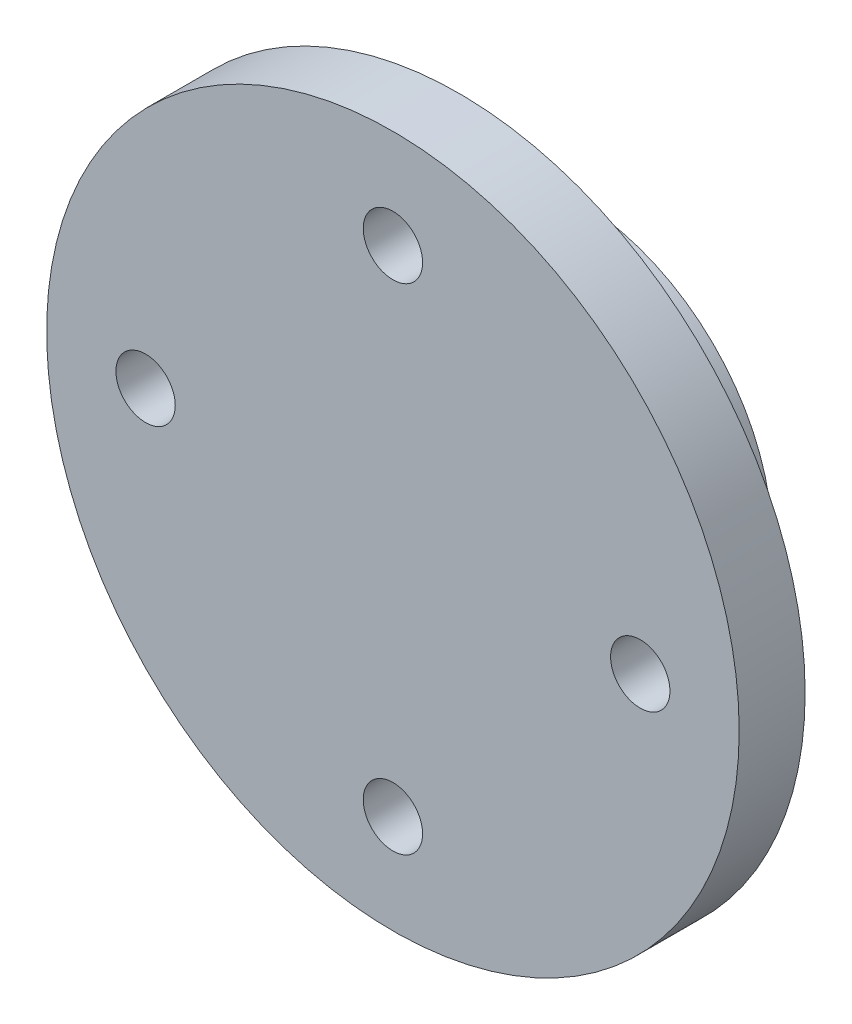
ISO-10303-21;
HEADER;
FILE_DESCRIPTION(('STEP AP214'),'2;1');
FILE_NAME('part.step','',(''),(''),'','','');
FILE_SCHEMA(('AUTOMOTIVE_DESIGN { 1 0 10303 214 1 1 1 1 }'));
ENDSEC;
DATA;
#1=APPLICATION_CONTEXT('core data for automotive mechanical design processes');
#2=APPLICATION_PROTOCOL_DEFINITION('international standard','automotive_design',2000,#1);
#3=PRODUCT_CONTEXT('',#1,'mechanical');
#4=PRODUCT('Part','Part','',(#3));
#5=PRODUCT_RELATED_PRODUCT_CATEGORY('part','',(#4));
#6=PRODUCT_DEFINITION_FORMATION('','',#4);
#7=PRODUCT_DEFINITION_CONTEXT('part definition',#1,'design');
#8=PRODUCT_DEFINITION('design','',#6,#7);
#9=PRODUCT_DEFINITION_SHAPE('','',#8);
#10=(LENGTH_UNIT() NAMED_UNIT(*) SI_UNIT(.MILLI.,.METRE.));
#11=(NAMED_UNIT(*) PLANE_ANGLE_UNIT() SI_UNIT($,.RADIAN.));
#12=(NAMED_UNIT(*) SI_UNIT($,.STERADIAN.) SOLID_ANGLE_UNIT());
#13=UNCERTAINTY_MEASURE_WITH_UNIT(LENGTH_MEASURE(1.E-05),#10,'distance_accuracy_value','');
#14=(GEOMETRIC_REPRESENTATION_CONTEXT(3) GLOBAL_UNCERTAINTY_ASSIGNED_CONTEXT((#13)) GLOBAL_UNIT_ASSIGNED_CONTEXT((#10,
#11,#12)) REPRESENTATION_CONTEXT('',''));
#15=CARTESIAN_POINT('',(0.,0.,0.));
#16=DIRECTION('',(0.,0.,1.));
#17=DIRECTION('',(1.,0.,0.));
#18=AXIS2_PLACEMENT_3D('',#15,#16,#17);
#19=CARTESIAN_POINT('',(0.,0.,0.));
#20=DIRECTION('',(0.,0.,1.));
#21=DIRECTION('',(1.,0.,0.));
#22=AXIS2_PLACEMENT_3D('',#19,#20,#21);
#23=PLANE('',#22);
#24=CARTESIAN_POINT('',(0.,0.,0.));
#25=DIRECTION('',(0.,0.,1.));
#26=DIRECTION('',(1.,0.,0.));
#27=AXIS2_PLACEMENT_3D('',#24,#25,#26);
#28=CIRCLE('',#27,6.);
#29=CARTESIAN_POINT('',(6.,0.,0.));
#30=VERTEX_POINT('',#29);
#31=EDGE_CURVE('E10',#30,#30,#28,.T.);
#32=ORIENTED_EDGE('',*,*,#31,.F.);
#33=EDGE_LOOP('',(#32));
#34=FACE_BOUND('',#33,.T.);
#35=ADVANCED_FACE('F15',(#34),#23,.F.);
#36=CARTESIAN_POINT('',(0.,0.,0.));
#37=DIRECTION('',(0.,0.,1.));
#38=DIRECTION('',(1.,0.,0.));
#39=AXIS2_PLACEMENT_3D('',#36,#37,#38);
#40=CYLINDRICAL_SURFACE('',#39,6.);
#41=CARTESIAN_POINT('',(0.,0.,3.5));
#42=DIRECTION('',(0.,0.,1.));
#43=DIRECTION('',(1.,0.,0.));
#44=AXIS2_PLACEMENT_3D('',#41,#42,#43);
#45=CIRCLE('',#44,6.);
#46=CARTESIAN_POINT('',(6.,0.,3.5));
#47=VERTEX_POINT('',#46);
#48=EDGE_CURVE('E108',#47,#47,#45,.T.);
#49=ORIENTED_EDGE('',*,*,#48,.F.);
#50=DIRECTION('',(0.,0.,1.));
#51=VECTOR('',#50,1.);
#52=CARTESIAN_POINT('',(6.,0.,0.));
#53=LINE('',#52,#51);
#54=EDGE_CURVE('E23',#30,#47,#53,.T.);
#55=ORIENTED_EDGE('',*,*,#54,.F.);
#56=ORIENTED_EDGE('',*,*,#31,.T.);
#57=ORIENTED_EDGE('',*,*,#54,.T.);
#58=EDGE_LOOP('',(#49,#55,#56,#57));
#59=FACE_BOUND('',#58,.T.);
#60=ADVANCED_FACE('F177',(#59),#40,.T.);
#61=CARTESIAN_POINT('',(0.,7.5,2.5));
#62=DIRECTION('',(0.,0.,1.));
#63=DIRECTION('',(1.,0.,0.));
#64=AXIS2_PLACEMENT_3D('',#61,#62,#63);
#65=CYLINDRICAL_SURFACE('',#64,0.9);
#66=DIRECTION('',(0.,0.,1.));
#67=VECTOR('',#66,1.);
#68=CARTESIAN_POINT('',(0.9,7.5,2.5));
#69=LINE('',#68,#67);
#70=CARTESIAN_POINT('',(0.9,7.5,3.5));
#71=VERTEX_POINT('',#70);
#72=CARTESIAN_POINT('',(0.9,7.5,5.5));
#73=VERTEX_POINT('',#72);
#74=EDGE_CURVE('E42',#71,#73,#69,.T.);
#75=ORIENTED_EDGE('',*,*,#74,.F.);
#76=CARTESIAN_POINT('',(0.,7.5,3.5));
#77=DIRECTION('',(0.,0.,1.));
#78=DIRECTION('',(1.,0.,0.));
#79=AXIS2_PLACEMENT_3D('',#76,#77,#78);
#80=CIRCLE('',#79,0.9);
#81=EDGE_CURVE('E129',#71,#71,#80,.T.);
#82=ORIENTED_EDGE('',*,*,#81,.F.);
#83=ORIENTED_EDGE('',*,*,#74,.T.);
#84=CARTESIAN_POINT('',(0.,7.5,5.5));
#85=DIRECTION('',(0.,0.,1.));
#86=DIRECTION('',(1.,0.,0.));
#87=AXIS2_PLACEMENT_3D('',#84,#85,#86);
#88=CIRCLE('',#87,0.9);
#89=EDGE_CURVE('E102',#73,#73,#88,.T.);
#90=ORIENTED_EDGE('',*,*,#89,.T.);
#91=EDGE_LOOP('',(#75,#82,#83,#90));
#92=FACE_BOUND('',#91,.T.);
#93=ADVANCED_FACE('F147',(#92),#65,.F.);
#94=CARTESIAN_POINT('',(7.5,0.,2.5));
#95=DIRECTION('',(0.,0.,1.));
#96=DIRECTION('',(1.,0.,0.));
#97=AXIS2_PLACEMENT_3D('',#94,#95,#96);
#98=CYLINDRICAL_SURFACE('',#97,0.9);
#99=DIRECTION('',(0.,0.,1.));
#100=VECTOR('',#99,1.);
#101=CARTESIAN_POINT('',(8.4,0.,2.5));
#102=LINE('',#101,#100);
#103=CARTESIAN_POINT('',(8.4,0.,3.5));
#104=VERTEX_POINT('',#103);
#105=CARTESIAN_POINT('',(8.4,0.,5.5));
#106=VERTEX_POINT('',#105);
#107=EDGE_CURVE('E141',#104,#106,#102,.T.);
#108=ORIENTED_EDGE('',*,*,#107,.F.);
#109=CARTESIAN_POINT('',(7.5,0.,3.5));
#110=DIRECTION('',(0.,0.,1.));
#111=DIRECTION('',(1.,0.,0.));
#112=AXIS2_PLACEMENT_3D('',#109,#110,#111);
#113=CIRCLE('',#112,0.9);
#114=EDGE_CURVE('E112',#104,#104,#113,.T.);
#115=ORIENTED_EDGE('',*,*,#114,.F.);
#116=ORIENTED_EDGE('',*,*,#107,.T.);
#117=CARTESIAN_POINT('',(7.5,0.,5.5));
#118=DIRECTION('',(0.,0.,1.));
#119=DIRECTION('',(1.,0.,0.));
#120=AXIS2_PLACEMENT_3D('',#117,#118,#119);
#121=CIRCLE('',#120,0.9);
#122=EDGE_CURVE('E100',#106,#106,#121,.T.);
#123=ORIENTED_EDGE('',*,*,#122,.T.);
#124=EDGE_LOOP('',(#108,#115,#116,#123));
#125=FACE_BOUND('',#124,.T.);
#126=ADVANCED_FACE('F185',(#125),#98,.F.);
#127=CARTESIAN_POINT('',(-7.5,0.,2.5));
#128=DIRECTION('',(0.,0.,1.));
#129=DIRECTION('',(1.,0.,0.));
#130=AXIS2_PLACEMENT_3D('',#127,#128,#129);
#131=CYLINDRICAL_SURFACE('',#130,0.9);
#132=DIRECTION('',(0.,0.,1.));
#133=VECTOR('',#132,1.);
#134=CARTESIAN_POINT('',(-6.6,0.,2.5));
#135=LINE('',#134,#133);
#136=CARTESIAN_POINT('',(-6.6,0.,3.5));
#137=VERTEX_POINT('',#136);
#138=CARTESIAN_POINT('',(-6.6,0.,5.5));
#139=VERTEX_POINT('',#138);
#140=EDGE_CURVE('E140',#137,#139,#135,.T.);
#141=ORIENTED_EDGE('',*,*,#140,.F.);
#142=CARTESIAN_POINT('',(-7.5,0.,3.5));
#143=DIRECTION('',(0.,0.,1.));
#144=DIRECTION('',(1.,0.,0.));
#145=AXIS2_PLACEMENT_3D('',#142,#143,#144);
#146=CIRCLE('',#145,0.9);
#147=EDGE_CURVE('E113',#137,#137,#146,.T.);
#148=ORIENTED_EDGE('',*,*,#147,.F.);
#149=ORIENTED_EDGE('',*,*,#140,.T.);
#150=CARTESIAN_POINT('',(-7.5,0.,5.5));
#151=DIRECTION('',(0.,0.,1.));
#152=DIRECTION('',(1.,0.,0.));
#153=AXIS2_PLACEMENT_3D('',#150,#151,#152);
#154=CIRCLE('',#153,0.9);
#155=EDGE_CURVE('E103',#139,#139,#154,.T.);
#156=ORIENTED_EDGE('',*,*,#155,.T.);
#157=EDGE_LOOP('',(#141,#148,#149,#156));
#158=FACE_BOUND('',#157,.T.);
#159=ADVANCED_FACE('F190',(#158),#131,.F.);
#160=CARTESIAN_POINT('',(0.,-7.5,2.5));
#161=DIRECTION('',(0.,0.,1.));
#162=DIRECTION('',(1.,0.,0.));
#163=AXIS2_PLACEMENT_3D('',#160,#161,#162);
#164=CYLINDRICAL_SURFACE('',#163,0.9);
#165=DIRECTION('',(0.,0.,1.));
#166=VECTOR('',#165,1.);
#167=CARTESIAN_POINT('',(0.9,-7.5,2.5));
#168=LINE('',#167,#166);
#169=CARTESIAN_POINT('',(0.9,-7.5,3.5));
#170=VERTEX_POINT('',#169);
#171=CARTESIAN_POINT('',(0.9,-7.5,5.5));
#172=VERTEX_POINT('',#171);
#173=EDGE_CURVE('E132',#170,#172,#168,.T.);
#174=ORIENTED_EDGE('',*,*,#173,.F.);
#175=CARTESIAN_POINT('',(0.,-7.5,3.5));
#176=DIRECTION('',(0.,0.,1.));
#177=DIRECTION('',(1.,0.,0.));
#178=AXIS2_PLACEMENT_3D('',#175,#176,#177);
#179=CIRCLE('',#178,0.9);
#180=EDGE_CURVE('E120',#170,#170,#179,.T.);
#181=ORIENTED_EDGE('',*,*,#180,.F.);
#182=ORIENTED_EDGE('',*,*,#173,.T.);
#183=CARTESIAN_POINT('',(0.,-7.5,5.5));
#184=DIRECTION('',(0.,0.,1.));
#185=DIRECTION('',(1.,0.,0.));
#186=AXIS2_PLACEMENT_3D('',#183,#184,#185);
#187=CIRCLE('',#186,0.9);
#188=EDGE_CURVE('E107',#172,#172,#187,.T.);
#189=ORIENTED_EDGE('',*,*,#188,.T.);
#190=EDGE_LOOP('',(#174,#181,#182,#189));
#191=FACE_BOUND('',#190,.T.);
#192=ADVANCED_FACE('F153',(#191),#164,.F.);
#193=CARTESIAN_POINT('',(0.,0.,3.5));
#194=DIRECTION('',(0.,0.,1.));
#195=DIRECTION('',(1.,0.,0.));
#196=AXIS2_PLACEMENT_3D('',#193,#194,#195);
#197=PLANE('',#196);
#198=ORIENTED_EDGE('',*,*,#81,.T.);
#199=EDGE_LOOP('',(#198));
#200=FACE_BOUND('',#199,.T.);
#201=ORIENTED_EDGE('',*,*,#114,.T.);
#202=EDGE_LOOP('',(#201));
#203=FACE_BOUND('',#202,.T.);
#204=ORIENTED_EDGE('',*,*,#48,.T.);
#205=EDGE_LOOP('',(#204));
#206=FACE_BOUND('',#205,.T.);
#207=ORIENTED_EDGE('',*,*,#147,.T.);
#208=EDGE_LOOP('',(#207));
#209=FACE_BOUND('',#208,.T.);
#210=ORIENTED_EDGE('',*,*,#180,.T.);
#211=EDGE_LOOP('',(#210));
#212=FACE_BOUND('',#211,.T.);
#213=CARTESIAN_POINT('',(0.,0.,3.5));
#214=DIRECTION('',(0.,0.,1.));
#215=DIRECTION('',(1.,0.,0.));
#216=AXIS2_PLACEMENT_3D('',#213,#214,#215);
#217=CIRCLE('',#216,10.5);
#218=CARTESIAN_POINT('',(10.5,0.,3.5));
#219=VERTEX_POINT('',#218);
#220=EDGE_CURVE('E90',#219,#219,#217,.T.);
#221=ORIENTED_EDGE('',*,*,#220,.F.);
#222=EDGE_LOOP('',(#221));
#223=FACE_BOUND('',#222,.T.);
#224=ADVANCED_FACE('F150',(#200,#203,#206,#209,#212,#223),#197,.F.);
#225=CARTESIAN_POINT('',(0.,0.,5.5));
#226=DIRECTION('',(0.,0.,1.));
#227=DIRECTION('',(1.,0.,0.));
#228=AXIS2_PLACEMENT_3D('',#225,#226,#227);
#229=PLANE('',#228);
#230=ORIENTED_EDGE('',*,*,#89,.F.);
#231=EDGE_LOOP('',(#230));
#232=FACE_BOUND('',#231,.T.);
#233=ORIENTED_EDGE('',*,*,#122,.F.);
#234=EDGE_LOOP('',(#233));
#235=FACE_BOUND('',#234,.T.);
#236=ORIENTED_EDGE('',*,*,#155,.F.);
#237=EDGE_LOOP('',(#236));
#238=FACE_BOUND('',#237,.T.);
#239=ORIENTED_EDGE('',*,*,#188,.F.);
#240=EDGE_LOOP('',(#239));
#241=FACE_BOUND('',#240,.T.);
#242=CARTESIAN_POINT('',(0.,0.,5.5));
#243=DIRECTION('',(0.,0.,1.));
#244=DIRECTION('',(1.,0.,0.));
#245=AXIS2_PLACEMENT_3D('',#242,#243,#244);
#246=CIRCLE('',#245,10.5);
#247=CARTESIAN_POINT('',(10.5,0.,5.5));
#248=VERTEX_POINT('',#247);
#249=EDGE_CURVE('E88',#248,#248,#246,.T.);
#250=ORIENTED_EDGE('',*,*,#249,.T.);
#251=EDGE_LOOP('',(#250));
#252=FACE_BOUND('',#251,.T.);
#253=ADVANCED_FACE('F94',(#232,#235,#238,#241,#252),#229,.T.);
#254=CARTESIAN_POINT('',(0.,0.,3.5));
#255=DIRECTION('',(0.,0.,1.));
#256=DIRECTION('',(1.,0.,0.));
#257=AXIS2_PLACEMENT_3D('',#254,#255,#256);
#258=CYLINDRICAL_SURFACE('',#257,10.5);
#259=ORIENTED_EDGE('',*,*,#249,.F.);
#260=DIRECTION('',(0.,0.,1.));
#261=VECTOR('',#260,1.);
#262=CARTESIAN_POINT('',(10.5,0.,3.5));
#263=LINE('',#262,#261);
#264=EDGE_CURVE('E85',#219,#248,#263,.T.);
#265=ORIENTED_EDGE('',*,*,#264,.F.);
#266=ORIENTED_EDGE('',*,*,#220,.T.);
#267=ORIENTED_EDGE('',*,*,#264,.T.);
#268=EDGE_LOOP('',(#259,#265,#266,#267));
#269=FACE_BOUND('',#268,.T.);
#270=ADVANCED_FACE('F87',(#269),#258,.T.);
#271=CLOSED_SHELL('',(#35,#60,#93,#126,#159,#192,#224,#253,#270));
#272=MANIFOLD_SOLID_BREP('B1',#271);
#273=ADVANCED_BREP_SHAPE_REPRESENTATION('',(#18,#272),#14);
#274=SHAPE_DEFINITION_REPRESENTATION(#9,#273);
ENDSEC;
END-ISO-10303-21;
